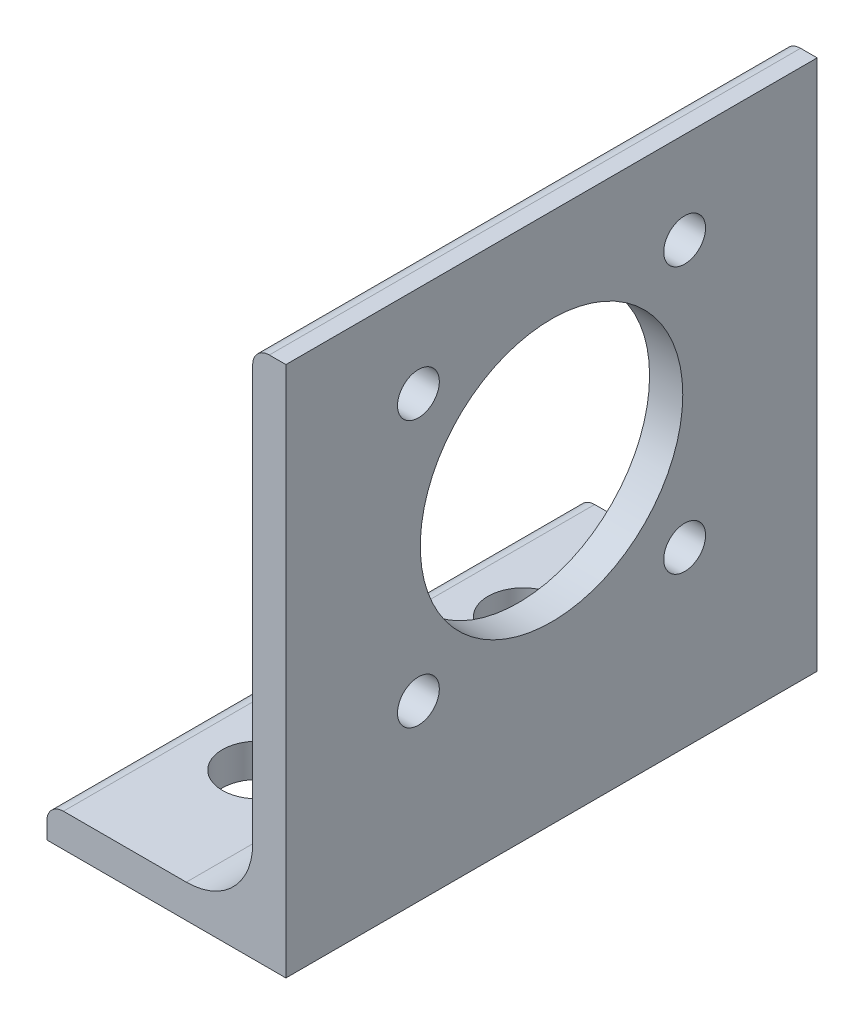
ISO-10303-21;
HEADER;
FILE_DESCRIPTION(('STEP AP214'),'2;1');
FILE_NAME('part.step','',(''),(''),'','','');
FILE_SCHEMA(('AUTOMOTIVE_DESIGN { 1 0 10303 214 1 1 1 1 }'));
ENDSEC;
DATA;
#1=APPLICATION_CONTEXT('core data for automotive mechanical design processes');
#2=APPLICATION_PROTOCOL_DEFINITION('international standard','automotive_design',2000,#1);
#3=PRODUCT_CONTEXT('',#1,'mechanical');
#4=PRODUCT('Part','Part','',(#3));
#5=PRODUCT_RELATED_PRODUCT_CATEGORY('part','',(#4));
#6=PRODUCT_DEFINITION_FORMATION('','',#4);
#7=PRODUCT_DEFINITION_CONTEXT('part definition',#1,'design');
#8=PRODUCT_DEFINITION('design','',#6,#7);
#9=PRODUCT_DEFINITION_SHAPE('','',#8);
#10=(LENGTH_UNIT() NAMED_UNIT(*) SI_UNIT(.MILLI.,.METRE.));
#11=(NAMED_UNIT(*) PLANE_ANGLE_UNIT() SI_UNIT($,.RADIAN.));
#12=(NAMED_UNIT(*) SI_UNIT($,.STERADIAN.) SOLID_ANGLE_UNIT());
#13=UNCERTAINTY_MEASURE_WITH_UNIT(LENGTH_MEASURE(1.E-05),#10,'distance_accuracy_value','');
#14=(GEOMETRIC_REPRESENTATION_CONTEXT(3) GLOBAL_UNCERTAINTY_ASSIGNED_CONTEXT((#13)) GLOBAL_UNIT_ASSIGNED_CONTEXT((#10,
#11,#12)) REPRESENTATION_CONTEXT('',''));
#15=CARTESIAN_POINT('',(0.,0.,0.));
#16=DIRECTION('',(0.,0.,1.));
#17=DIRECTION('',(1.,0.,0.));
#18=AXIS2_PLACEMENT_3D('',#15,#16,#17);
#19=CARTESIAN_POINT('',(-25.4,0.,25.4));
#20=DIRECTION('',(0.,1.,0.));
#21=DIRECTION('',(0.,0.,1.));
#22=AXIS2_PLACEMENT_3D('',#19,#20,#21);
#23=PLANE('',#22);
#24=CARTESIAN_POINT('',(10.00125,0.,-12.7));
#25=DIRECTION('',(0.,1.,0.));
#26=DIRECTION('',(-1.,0.,0.));
#27=AXIS2_PLACEMENT_3D('',#24,#25,#26);
#28=CIRCLE('',#27,3.3782);
#29=CARTESIAN_POINT('',(6.62305000000001,0.,-12.7));
#30=VERTEX_POINT('',#29);
#31=EDGE_CURVE('E220',#30,#30,#28,.T.);
#32=ORIENTED_EDGE('',*,*,#31,.T.);
#33=EDGE_LOOP('',(#32));
#34=FACE_BOUND('',#33,.T.);
#35=CARTESIAN_POINT('',(10.00125,0.,12.7));
#36=DIRECTION('',(0.,1.,0.));
#37=DIRECTION('',(-1.,0.,0.));
#38=AXIS2_PLACEMENT_3D('',#35,#36,#37);
#39=CIRCLE('',#38,3.3782);
#40=CARTESIAN_POINT('',(6.62305000000001,0.,12.7));
#41=VERTEX_POINT('',#40);
#42=EDGE_CURVE('E209',#41,#41,#39,.T.);
#43=ORIENTED_EDGE('',*,*,#42,.T.);
#44=EDGE_LOOP('',(#43));
#45=FACE_BOUND('',#44,.T.);
#46=DIRECTION('',(1.,0.,0.));
#47=VECTOR('',#46,1.);
#48=CARTESIAN_POINT('',(-25.4,0.,25.4));
#49=LINE('',#48,#47);
#50=CARTESIAN_POINT('',(2.54,0.,25.4));
#51=VERTEX_POINT('',#50);
#52=CARTESIAN_POINT('',(25.4,0.,25.4));
#53=VERTEX_POINT('',#52);
#54=EDGE_CURVE('E124',#51,#53,#49,.T.);
#55=ORIENTED_EDGE('',*,*,#54,.F.);
#56=DIRECTION('',(0.,0.,-1.));
#57=VECTOR('',#56,1.);
#58=CARTESIAN_POINT('',(2.54,0.,25.4));
#59=LINE('',#58,#57);
#60=CARTESIAN_POINT('',(2.54,0.,-25.4));
#61=VERTEX_POINT('',#60);
#62=EDGE_CURVE('E111',#51,#61,#59,.T.);
#63=ORIENTED_EDGE('',*,*,#62,.T.);
#64=DIRECTION('',(1.,0.,0.));
#65=VECTOR('',#64,1.);
#66=CARTESIAN_POINT('',(-25.4,0.,-25.4));
#67=LINE('',#66,#65);
#68=CARTESIAN_POINT('',(25.4,0.,-25.4));
#69=VERTEX_POINT('',#68);
#70=EDGE_CURVE('E122',#61,#69,#67,.T.);
#71=ORIENTED_EDGE('',*,*,#70,.T.);
#72=DIRECTION('',(0.,0.,-1.));
#73=VECTOR('',#72,1.);
#74=CARTESIAN_POINT('',(25.4,0.,25.4));
#75=LINE('',#74,#73);
#76=EDGE_CURVE('E118',#53,#69,#75,.T.);
#77=ORIENTED_EDGE('',*,*,#76,.F.);
#78=EDGE_LOOP('',(#55,#63,#71,#77));
#79=FACE_BOUND('',#78,.T.);
#80=ADVANCED_FACE('F38',(#34,#45,#79),#23,.F.);
#81=CARTESIAN_POINT('',(25.4,0.,25.4));
#82=DIRECTION('',(-1.,0.,0.));
#83=DIRECTION('',(0.,0.,1.));
#84=AXIS2_PLACEMENT_3D('',#81,#82,#83);
#85=PLANE('',#84);
#86=CARTESIAN_POINT('',(25.4,16.6,12.7279220196385));
#87=DIRECTION('',(1.,0.,0.));
#88=DIRECTION('',(0.,0.,-1.));
#89=AXIS2_PLACEMENT_3D('',#86,#87,#88);
#90=CIRCLE('',#89,2.000000064);
#91=CARTESIAN_POINT('',(25.4,16.6,10.7279219556385));
#92=VERTEX_POINT('',#91);
#93=EDGE_CURVE('E346',#92,#92,#90,.T.);
#94=ORIENTED_EDGE('',*,*,#93,.F.);
#95=EDGE_LOOP('',(#94));
#96=FACE_BOUND('',#95,.T.);
#97=CARTESIAN_POINT('',(25.4,42.0558440392772,12.7279220196385));
#98=DIRECTION('',(1.,0.,0.));
#99=DIRECTION('',(0.,0.,-1.));
#100=AXIS2_PLACEMENT_3D('',#97,#98,#99);
#101=CIRCLE('',#100,2.000000064);
#102=CARTESIAN_POINT('',(25.4,42.0558440392772,10.7279219556385));
#103=VERTEX_POINT('',#102);
#104=EDGE_CURVE('E343',#103,#103,#101,.T.);
#105=ORIENTED_EDGE('',*,*,#104,.F.);
#106=EDGE_LOOP('',(#105));
#107=FACE_BOUND('',#106,.T.);
#108=CARTESIAN_POINT('',(25.4,29.3279220196387,0.));
#109=DIRECTION('',(1.,0.,0.));
#110=DIRECTION('',(0.,0.,-1.));
#111=AXIS2_PLACEMENT_3D('',#108,#109,#110);
#112=CIRCLE('',#111,12.5499999999999);
#113=CARTESIAN_POINT('',(25.4,29.3279220196387,-12.55));
#114=VERTEX_POINT('',#113);
#115=EDGE_CURVE('E328',#114,#114,#112,.T.);
#116=ORIENTED_EDGE('',*,*,#115,.F.);
#117=EDGE_LOOP('',(#116));
#118=FACE_BOUND('',#117,.T.);
#119=CARTESIAN_POINT('',(25.4,42.0558440392772,-12.7279220196385));
#120=DIRECTION('',(1.,0.,0.));
#121=DIRECTION('',(0.,0.,-1.));
#122=AXIS2_PLACEMENT_3D('',#119,#120,#121);
#123=CIRCLE('',#122,2.000000064);
#124=CARTESIAN_POINT('',(25.4,42.0558440392772,-14.7279220836385));
#125=VERTEX_POINT('',#124);
#126=EDGE_CURVE('E339',#125,#125,#123,.T.);
#127=ORIENTED_EDGE('',*,*,#126,.F.);
#128=EDGE_LOOP('',(#127));
#129=FACE_BOUND('',#128,.T.);
#130=CARTESIAN_POINT('',(25.4,16.6,-12.7279220196385));
#131=DIRECTION('',(1.,0.,0.));
#132=DIRECTION('',(0.,0.,-1.));
#133=AXIS2_PLACEMENT_3D('',#130,#131,#132);
#134=CIRCLE('',#133,2.000000064);
#135=CARTESIAN_POINT('',(25.4,16.6,-14.7279220836385));
#136=VERTEX_POINT('',#135);
#137=EDGE_CURVE('E190',#136,#136,#134,.T.);
#138=ORIENTED_EDGE('',*,*,#137,.F.);
#139=EDGE_LOOP('',(#138));
#140=FACE_BOUND('',#139,.T.);
#141=DIRECTION('',(0.,1.,0.));
#142=VECTOR('',#141,1.);
#143=CARTESIAN_POINT('',(25.4,0.,-25.4));
#144=LINE('',#143,#142);
#145=CARTESIAN_POINT('',(25.4,50.8,-25.4));
#146=VERTEX_POINT('',#145);
#147=EDGE_CURVE('E131',#69,#146,#144,.T.);
#148=ORIENTED_EDGE('',*,*,#147,.T.);
#149=DIRECTION('',(0.,0.,-1.));
#150=VECTOR('',#149,1.);
#151=CARTESIAN_POINT('',(25.4,50.8,25.4));
#152=LINE('',#151,#150);
#153=CARTESIAN_POINT('',(25.4,50.8,25.4));
#154=VERTEX_POINT('',#153);
#155=EDGE_CURVE('E172',#154,#146,#152,.T.);
#156=ORIENTED_EDGE('',*,*,#155,.F.);
#157=DIRECTION('',(0.,1.,0.));
#158=VECTOR('',#157,1.);
#159=CARTESIAN_POINT('',(25.4,0.,25.4));
#160=LINE('',#159,#158);
#161=EDGE_CURVE('E224',#53,#154,#160,.T.);
#162=ORIENTED_EDGE('',*,*,#161,.F.);
#163=ORIENTED_EDGE('',*,*,#76,.T.);
#164=EDGE_LOOP('',(#148,#156,#162,#163));
#165=FACE_BOUND('',#164,.T.);
#166=ADVANCED_FACE('F267',(#96,#107,#118,#129,#140,#165),#85,.F.);
#167=CARTESIAN_POINT('',(23.8125,50.8,25.4));
#168=DIRECTION('',(0.,-1.,0.));
#169=DIRECTION('',(0.,0.,-1.));
#170=AXIS2_PLACEMENT_3D('',#167,#168,#169);
#171=PLANE('',#170);
#172=DIRECTION('',(-1.,0.,0.));
#173=VECTOR('',#172,1.);
#174=CARTESIAN_POINT('',(23.8125,50.8,-25.4));
#175=LINE('',#174,#173);
#176=CARTESIAN_POINT('',(23.8125,50.8,-25.4));
#177=VERTEX_POINT('',#176);
#178=EDGE_CURVE('E135',#146,#177,#175,.T.);
#179=ORIENTED_EDGE('',*,*,#178,.T.);
#180=DIRECTION('',(0.,0.,-1.));
#181=VECTOR('',#180,1.);
#182=CARTESIAN_POINT('',(23.8125,50.8,25.4));
#183=LINE('',#182,#181);
#184=CARTESIAN_POINT('',(23.8125,50.8,25.4));
#185=VERTEX_POINT('',#184);
#186=EDGE_CURVE('E168',#185,#177,#183,.T.);
#187=ORIENTED_EDGE('',*,*,#186,.F.);
#188=DIRECTION('',(-1.,0.,0.));
#189=VECTOR('',#188,1.);
#190=CARTESIAN_POINT('',(23.8125,50.8,25.4));
#191=LINE('',#190,#189);
#192=EDGE_CURVE('E227',#154,#185,#191,.T.);
#193=ORIENTED_EDGE('',*,*,#192,.F.);
#194=ORIENTED_EDGE('',*,*,#155,.T.);
#195=EDGE_LOOP('',(#179,#187,#193,#194));
#196=FACE_BOUND('',#195,.T.);
#197=ADVANCED_FACE('F262',(#196),#171,.F.);
#198=CARTESIAN_POINT('',(23.8125,49.2125,25.4));
#199=DIRECTION('',(0.,0.,-1.));
#200=DIRECTION('',(-1.,0.,0.));
#201=AXIS2_PLACEMENT_3D('',#198,#199,#200);
#202=CYLINDRICAL_SURFACE('',#201,1.5875);
#203=CARTESIAN_POINT('',(23.8125,49.2125,-25.4));
#204=DIRECTION('',(0.,0.,1.));
#205=DIRECTION('',(-1.,0.,0.));
#206=AXIS2_PLACEMENT_3D('',#203,#204,#205);
#207=CIRCLE('',#206,1.5875);
#208=CARTESIAN_POINT('',(22.225,49.2125,-25.4));
#209=VERTEX_POINT('',#208);
#210=EDGE_CURVE('E143',#177,#209,#207,.T.);
#211=ORIENTED_EDGE('',*,*,#210,.T.);
#212=DIRECTION('',(0.,0.,-1.));
#213=VECTOR('',#212,1.);
#214=CARTESIAN_POINT('',(22.225,49.2125,25.4));
#215=LINE('',#214,#213);
#216=CARTESIAN_POINT('',(22.225,49.2125,25.4));
#217=VERTEX_POINT('',#216);
#218=EDGE_CURVE('E164',#217,#209,#215,.T.);
#219=ORIENTED_EDGE('',*,*,#218,.F.);
#220=CARTESIAN_POINT('',(23.8125,49.2125,25.4));
#221=DIRECTION('',(0.,0.,1.));
#222=DIRECTION('',(-1.,0.,0.));
#223=AXIS2_PLACEMENT_3D('',#220,#221,#222);
#224=CIRCLE('',#223,1.5875);
#225=EDGE_CURVE('E230',#185,#217,#224,.T.);
#226=ORIENTED_EDGE('',*,*,#225,.F.);
#227=ORIENTED_EDGE('',*,*,#186,.T.);
#228=EDGE_LOOP('',(#211,#219,#226,#227));
#229=FACE_BOUND('',#228,.T.);
#230=ADVANCED_FACE('F259',(#229),#202,.T.);
#231=CARTESIAN_POINT('',(22.225,49.2125,25.4));
#232=DIRECTION('',(1.,0.,0.));
#233=DIRECTION('',(0.,0.,-1.));
#234=AXIS2_PLACEMENT_3D('',#231,#232,#233);
#235=PLANE('',#234);
#236=CARTESIAN_POINT('',(22.225,16.6,12.7279220196385));
#237=DIRECTION('',(1.,0.,0.));
#238=DIRECTION('',(0.,0.,-1.));
#239=AXIS2_PLACEMENT_3D('',#236,#237,#238);
#240=CIRCLE('',#239,2.000000064);
#241=CARTESIAN_POINT('',(22.225,16.6,10.7279219556385));
#242=VERTEX_POINT('',#241);
#243=EDGE_CURVE('E42',#242,#242,#240,.T.);
#244=ORIENTED_EDGE('',*,*,#243,.T.);
#245=EDGE_LOOP('',(#244));
#246=FACE_BOUND('',#245,.T.);
#247=CARTESIAN_POINT('',(22.225,42.0558440392772,12.7279220196385));
#248=DIRECTION('',(1.,0.,0.));
#249=DIRECTION('',(0.,0.,-1.));
#250=AXIS2_PLACEMENT_3D('',#247,#248,#249);
#251=CIRCLE('',#250,2.000000064);
#252=CARTESIAN_POINT('',(22.225,42.0558440392772,10.7279219556385));
#253=VERTEX_POINT('',#252);
#254=EDGE_CURVE('E197',#253,#253,#251,.T.);
#255=ORIENTED_EDGE('',*,*,#254,.T.);
#256=EDGE_LOOP('',(#255));
#257=FACE_BOUND('',#256,.T.);
#258=CARTESIAN_POINT('',(22.225,29.3279220196387,0.));
#259=DIRECTION('',(1.,0.,0.));
#260=DIRECTION('',(0.,0.,-1.));
#261=AXIS2_PLACEMENT_3D('',#258,#259,#260);
#262=CIRCLE('',#261,12.5499999999999);
#263=CARTESIAN_POINT('',(22.225,29.3279220196387,-12.55));
#264=VERTEX_POINT('',#263);
#265=EDGE_CURVE('E194',#264,#264,#262,.T.);
#266=ORIENTED_EDGE('',*,*,#265,.T.);
#267=EDGE_LOOP('',(#266));
#268=FACE_BOUND('',#267,.T.);
#269=CARTESIAN_POINT('',(22.225,42.0558440392772,-12.7279220196385));
#270=DIRECTION('',(1.,0.,0.));
#271=DIRECTION('',(0.,0.,-1.));
#272=AXIS2_PLACEMENT_3D('',#269,#270,#271);
#273=CIRCLE('',#272,2.000000064);
#274=CARTESIAN_POINT('',(22.225,42.0558440392772,-14.7279220836385));
#275=VERTEX_POINT('',#274);
#276=EDGE_CURVE('E189',#275,#275,#273,.T.);
#277=ORIENTED_EDGE('',*,*,#276,.T.);
#278=EDGE_LOOP('',(#277));
#279=FACE_BOUND('',#278,.T.);
#280=CARTESIAN_POINT('',(22.225,16.6,-12.7279220196385));
#281=DIRECTION('',(1.,0.,0.));
#282=DIRECTION('',(0.,0.,-1.));
#283=AXIS2_PLACEMENT_3D('',#280,#281,#282);
#284=CIRCLE('',#283,2.000000064);
#285=CARTESIAN_POINT('',(22.225,16.6,-14.7279220836385));
#286=VERTEX_POINT('',#285);
#287=EDGE_CURVE('E185',#286,#286,#284,.T.);
#288=ORIENTED_EDGE('',*,*,#287,.T.);
#289=EDGE_LOOP('',(#288));
#290=FACE_BOUND('',#289,.T.);
#291=DIRECTION('',(0.,-1.,0.));
#292=VECTOR('',#291,1.);
#293=CARTESIAN_POINT('',(22.225,49.2125,-25.4));
#294=LINE('',#293,#292);
#295=CARTESIAN_POINT('',(22.225,9.525,-25.4));
#296=VERTEX_POINT('',#295);
#297=EDGE_CURVE('E146',#209,#296,#294,.T.);
#298=ORIENTED_EDGE('',*,*,#297,.T.);
#299=DIRECTION('',(0.,0.,-1.));
#300=VECTOR('',#299,1.);
#301=CARTESIAN_POINT('',(22.225,9.525,25.4));
#302=LINE('',#301,#300);
#303=CARTESIAN_POINT('',(22.225,9.525,25.4));
#304=VERTEX_POINT('',#303);
#305=EDGE_CURVE('E160',#304,#296,#302,.T.);
#306=ORIENTED_EDGE('',*,*,#305,.F.);
#307=DIRECTION('',(0.,-1.,0.));
#308=VECTOR('',#307,1.);
#309=CARTESIAN_POINT('',(22.225,49.2125,25.4));
#310=LINE('',#309,#308);
#311=EDGE_CURVE('E233',#217,#304,#310,.T.);
#312=ORIENTED_EDGE('',*,*,#311,.F.);
#313=ORIENTED_EDGE('',*,*,#218,.T.);
#314=EDGE_LOOP('',(#298,#306,#312,#313));
#315=FACE_BOUND('',#314,.T.);
#316=ADVANCED_FACE('F255',(#246,#257,#268,#279,#290,#315),#235,.F.);
#317=CARTESIAN_POINT('',(15.875,9.525,25.4));
#318=DIRECTION('',(0.,0.,-1.));
#319=DIRECTION('',(-1.,0.,0.));
#320=AXIS2_PLACEMENT_3D('',#317,#318,#319);
#321=CYLINDRICAL_SURFACE('',#320,6.35);
#322=CARTESIAN_POINT('',(15.875,9.525,-25.4));
#323=DIRECTION('',(0.,0.,-1.));
#324=DIRECTION('',(-1.,0.,0.));
#325=AXIS2_PLACEMENT_3D('',#322,#323,#324);
#326=CIRCLE('',#325,6.35);
#327=CARTESIAN_POINT('',(15.875,3.175,-25.4));
#328=VERTEX_POINT('',#327);
#329=EDGE_CURVE('E149',#296,#328,#326,.T.);
#330=ORIENTED_EDGE('',*,*,#329,.T.);
#331=DIRECTION('',(0.,0.,-1.));
#332=VECTOR('',#331,1.);
#333=CARTESIAN_POINT('',(15.875,3.175,25.4));
#334=LINE('',#333,#332);
#335=CARTESIAN_POINT('',(15.875,3.175,25.4));
#336=VERTEX_POINT('',#335);
#337=EDGE_CURVE('E156',#336,#328,#334,.T.);
#338=ORIENTED_EDGE('',*,*,#337,.F.);
#339=CARTESIAN_POINT('',(15.875,9.525,25.4));
#340=DIRECTION('',(0.,0.,-1.));
#341=DIRECTION('',(-1.,0.,0.));
#342=AXIS2_PLACEMENT_3D('',#339,#340,#341);
#343=CIRCLE('',#342,6.35);
#344=EDGE_CURVE('E235',#304,#336,#343,.T.);
#345=ORIENTED_EDGE('',*,*,#344,.F.);
#346=ORIENTED_EDGE('',*,*,#305,.T.);
#347=EDGE_LOOP('',(#330,#338,#345,#346));
#348=FACE_BOUND('',#347,.T.);
#349=ADVANCED_FACE('F251',(#348),#321,.F.);
#350=CARTESIAN_POINT('',(15.875,3.175,25.4));
#351=DIRECTION('',(0.,-1.,0.));
#352=DIRECTION('',(1.,0.,0.));
#353=AXIS2_PLACEMENT_3D('',#350,#351,#352);
#354=PLANE('',#353);
#355=CARTESIAN_POINT('',(10.00125,3.175,-12.7));
#356=DIRECTION('',(0.,1.,0.));
#357=DIRECTION('',(-1.,0.,0.));
#358=AXIS2_PLACEMENT_3D('',#355,#356,#357);
#359=CIRCLE('',#358,3.3782);
#360=CARTESIAN_POINT('',(6.62305000000001,3.175,-12.7));
#361=VERTEX_POINT('',#360);
#362=EDGE_CURVE('E215',#361,#361,#359,.T.);
#363=ORIENTED_EDGE('',*,*,#362,.F.);
#364=EDGE_LOOP('',(#363));
#365=FACE_BOUND('',#364,.T.);
#366=CARTESIAN_POINT('',(10.00125,3.175,12.7));
#367=DIRECTION('',(0.,1.,0.));
#368=DIRECTION('',(-1.,0.,0.));
#369=AXIS2_PLACEMENT_3D('',#366,#367,#368);
#370=CIRCLE('',#369,3.3782);
#371=CARTESIAN_POINT('',(6.62305000000001,3.175,12.7));
#372=VERTEX_POINT('',#371);
#373=EDGE_CURVE('E204',#372,#372,#370,.T.);
#374=ORIENTED_EDGE('',*,*,#373,.F.);
#375=EDGE_LOOP('',(#374));
#376=FACE_BOUND('',#375,.T.);
#377=DIRECTION('',(-1.,0.,0.));
#378=VECTOR('',#377,1.);
#379=CARTESIAN_POINT('',(15.875,3.175,-25.4));
#380=LINE('',#379,#378);
#381=CARTESIAN_POINT('',(4.1275,3.175,-25.4));
#382=VERTEX_POINT('',#381);
#383=EDGE_CURVE('E152',#328,#382,#380,.T.);
#384=ORIENTED_EDGE('',*,*,#383,.T.);
#385=DIRECTION('',(0.,0.,1.));
#386=VECTOR('',#385,1.);
#387=CARTESIAN_POINT('',(4.1275,3.175,25.4));
#388=LINE('',#387,#386);
#389=CARTESIAN_POINT('',(4.1275,3.175,25.4));
#390=VERTEX_POINT('',#389);
#391=EDGE_CURVE('E117',#382,#390,#388,.T.);
#392=ORIENTED_EDGE('',*,*,#391,.T.);
#393=DIRECTION('',(-1.,0.,0.));
#394=VECTOR('',#393,1.);
#395=CARTESIAN_POINT('',(15.875,3.175,25.4));
#396=LINE('',#395,#394);
#397=EDGE_CURVE('E138',#336,#390,#396,.T.);
#398=ORIENTED_EDGE('',*,*,#397,.F.);
#399=ORIENTED_EDGE('',*,*,#337,.T.);
#400=EDGE_LOOP('',(#384,#392,#398,#399));
#401=FACE_BOUND('',#400,.T.);
#402=ADVANCED_FACE('F243',(#365,#376,#401),#354,.F.);
#403=CARTESIAN_POINT('',(23.8125,49.2125,25.4));
#404=DIRECTION('',(0.,0.,-1.));
#405=DIRECTION('',(-1.,0.,0.));
#406=AXIS2_PLACEMENT_3D('',#403,#404,#405);
#407=PLANE('',#406);
#408=ORIENTED_EDGE('',*,*,#397,.T.);
#409=CARTESIAN_POINT('',(4.1275,1.5875,25.4));
#410=DIRECTION('',(0.,0.,-1.));
#411=DIRECTION('',(-1.,0.,0.));
#412=AXIS2_PLACEMENT_3D('',#409,#410,#411);
#413=CIRCLE('',#412,1.5875);
#414=CARTESIAN_POINT('',(2.54,1.5875,25.4));
#415=VERTEX_POINT('',#414);
#416=EDGE_CURVE('E63',#390,#415,#413,.F.);
#417=ORIENTED_EDGE('',*,*,#416,.T.);
#418=DIRECTION('',(0.,-1.,0.));
#419=VECTOR('',#418,1.);
#420=CARTESIAN_POINT('',(2.54,8.39955257270711,25.4));
#421=LINE('',#420,#419);
#422=EDGE_CURVE('E126',#415,#51,#421,.T.);
#423=ORIENTED_EDGE('',*,*,#422,.T.);
#424=ORIENTED_EDGE('',*,*,#54,.T.);
#425=ORIENTED_EDGE('',*,*,#161,.T.);
#426=ORIENTED_EDGE('',*,*,#192,.T.);
#427=ORIENTED_EDGE('',*,*,#225,.T.);
#428=ORIENTED_EDGE('',*,*,#311,.T.);
#429=ORIENTED_EDGE('',*,*,#344,.T.);
#430=EDGE_LOOP('',(#408,#417,#423,#424,#425,#426,#427,#428,#429));
#431=FACE_BOUND('',#430,.T.);
#432=ADVANCED_FACE('F241',(#431),#407,.F.);
#433=CARTESIAN_POINT('',(23.8125,49.2125,-25.4));
#434=DIRECTION('',(0.,0.,-1.));
#435=DIRECTION('',(-1.,0.,0.));
#436=AXIS2_PLACEMENT_3D('',#433,#434,#435);
#437=PLANE('',#436);
#438=DIRECTION('',(0.,-1.,0.));
#439=VECTOR('',#438,1.);
#440=CARTESIAN_POINT('',(2.54,49.2125,-25.4));
#441=LINE('',#440,#439);
#442=CARTESIAN_POINT('',(2.54,1.5875,-25.4));
#443=VERTEX_POINT('',#442);
#444=EDGE_CURVE('E108',#443,#61,#441,.T.);
#445=ORIENTED_EDGE('',*,*,#444,.F.);
#446=CARTESIAN_POINT('',(4.1275,1.5875,-25.4));
#447=DIRECTION('',(0.,0.,-1.));
#448=DIRECTION('',(-1.,0.,0.));
#449=AXIS2_PLACEMENT_3D('',#446,#447,#448);
#450=CIRCLE('',#449,1.5875);
#451=EDGE_CURVE('E11',#443,#382,#450,.T.);
#452=ORIENTED_EDGE('',*,*,#451,.T.);
#453=ORIENTED_EDGE('',*,*,#383,.F.);
#454=ORIENTED_EDGE('',*,*,#329,.F.);
#455=ORIENTED_EDGE('',*,*,#297,.F.);
#456=ORIENTED_EDGE('',*,*,#210,.F.);
#457=ORIENTED_EDGE('',*,*,#178,.F.);
#458=ORIENTED_EDGE('',*,*,#147,.F.);
#459=ORIENTED_EDGE('',*,*,#70,.F.);
#460=EDGE_LOOP('',(#445,#452,#453,#454,#455,#456,#457,#458,#459));
#461=FACE_BOUND('',#460,.T.);
#462=ADVANCED_FACE('F129',(#461),#437,.T.);
#463=CARTESIAN_POINT('',(2.54,8.39955257270711,25.4));
#464=DIRECTION('',(1.,0.,0.));
#465=DIRECTION('',(0.,1.,0.));
#466=AXIS2_PLACEMENT_3D('',#463,#464,#465);
#467=PLANE('',#466);
#468=ORIENTED_EDGE('',*,*,#422,.F.);
#469=DIRECTION('',(0.,0.,1.));
#470=VECTOR('',#469,1.);
#471=CARTESIAN_POINT('',(2.54,1.5875,25.4));
#472=LINE('',#471,#470);
#473=EDGE_CURVE('E48',#415,#443,#472,.F.);
#474=ORIENTED_EDGE('',*,*,#473,.T.);
#475=ORIENTED_EDGE('',*,*,#444,.T.);
#476=ORIENTED_EDGE('',*,*,#62,.F.);
#477=EDGE_LOOP('',(#468,#474,#475,#476));
#478=FACE_BOUND('',#477,.T.);
#479=ADVANCED_FACE('F110',(#478),#467,.F.);
#480=CARTESIAN_POINT('',(4.1275,1.5875,25.4));
#481=DIRECTION('',(0.,0.,1.));
#482=DIRECTION('',(1.,0.,0.));
#483=AXIS2_PLACEMENT_3D('',#480,#481,#482);
#484=CYLINDRICAL_SURFACE('',#483,1.5875);
#485=ORIENTED_EDGE('',*,*,#451,.F.);
#486=ORIENTED_EDGE('',*,*,#473,.F.);
#487=ORIENTED_EDGE('',*,*,#416,.F.);
#488=ORIENTED_EDGE('',*,*,#391,.F.);
#489=EDGE_LOOP('',(#485,#486,#487,#488));
#490=FACE_BOUND('',#489,.T.);
#491=ADVANCED_FACE('F40',(#490),#484,.T.);
#492=CARTESIAN_POINT('',(10.00125,0.,12.7));
#493=DIRECTION('',(0.,1.,0.));
#494=DIRECTION('',(-1.,0.,0.));
#495=AXIS2_PLACEMENT_3D('',#492,#493,#494);
#496=CYLINDRICAL_SURFACE('',#495,3.3782);
#497=ORIENTED_EDGE('',*,*,#42,.F.);
#498=EDGE_LOOP('',(#497));
#499=FACE_BOUND('',#498,.T.);
#500=ORIENTED_EDGE('',*,*,#373,.T.);
#501=EDGE_LOOP('',(#500));
#502=FACE_BOUND('',#501,.T.);
#503=ADVANCED_FACE('F296',(#499,#502),#496,.F.);
#504=CARTESIAN_POINT('',(10.00125,0.,-12.7));
#505=DIRECTION('',(0.,1.,0.));
#506=DIRECTION('',(-1.,0.,0.));
#507=AXIS2_PLACEMENT_3D('',#504,#505,#506);
#508=CYLINDRICAL_SURFACE('',#507,3.3782);
#509=ORIENTED_EDGE('',*,*,#31,.F.);
#510=EDGE_LOOP('',(#509));
#511=FACE_BOUND('',#510,.T.);
#512=ORIENTED_EDGE('',*,*,#362,.T.);
#513=EDGE_LOOP('',(#512));
#514=FACE_BOUND('',#513,.T.);
#515=ADVANCED_FACE('F299',(#511,#514),#508,.F.);
#516=CARTESIAN_POINT('',(2.54,16.6,-12.7279220196385));
#517=DIRECTION('',(1.,0.,0.));
#518=DIRECTION('',(0.,0.,-1.));
#519=AXIS2_PLACEMENT_3D('',#516,#517,#518);
#520=CYLINDRICAL_SURFACE('',#519,2.000000064);
#521=ORIENTED_EDGE('',*,*,#137,.T.);
#522=EDGE_LOOP('',(#521));
#523=FACE_BOUND('',#522,.T.);
#524=ORIENTED_EDGE('',*,*,#287,.F.);
#525=EDGE_LOOP('',(#524));
#526=FACE_BOUND('',#525,.T.);
#527=ADVANCED_FACE('F303',(#523,#526),#520,.F.);
#528=CARTESIAN_POINT('',(2.54,42.0558440392772,-12.7279220196385));
#529=DIRECTION('',(1.,0.,0.));
#530=DIRECTION('',(0.,0.,-1.));
#531=AXIS2_PLACEMENT_3D('',#528,#529,#530);
#532=CYLINDRICAL_SURFACE('',#531,2.000000064);
#533=ORIENTED_EDGE('',*,*,#126,.T.);
#534=EDGE_LOOP('',(#533));
#535=FACE_BOUND('',#534,.T.);
#536=ORIENTED_EDGE('',*,*,#276,.F.);
#537=EDGE_LOOP('',(#536));
#538=FACE_BOUND('',#537,.T.);
#539=ADVANCED_FACE('F307',(#535,#538),#532,.F.);
#540=CARTESIAN_POINT('',(2.54,29.3279220196387,0.));
#541=DIRECTION('',(1.,0.,0.));
#542=DIRECTION('',(0.,0.,-1.));
#543=AXIS2_PLACEMENT_3D('',#540,#541,#542);
#544=CYLINDRICAL_SURFACE('',#543,12.5499999999999);
#545=ORIENTED_EDGE('',*,*,#115,.T.);
#546=EDGE_LOOP('',(#545));
#547=FACE_BOUND('',#546,.T.);
#548=ORIENTED_EDGE('',*,*,#265,.F.);
#549=EDGE_LOOP('',(#548));
#550=FACE_BOUND('',#549,.T.);
#551=ADVANCED_FACE('F313',(#547,#550),#544,.F.);
#552=CARTESIAN_POINT('',(2.54,42.0558440392772,12.7279220196385));
#553=DIRECTION('',(1.,0.,0.));
#554=DIRECTION('',(0.,0.,-1.));
#555=AXIS2_PLACEMENT_3D('',#552,#553,#554);
#556=CYLINDRICAL_SURFACE('',#555,2.000000064);
#557=ORIENTED_EDGE('',*,*,#104,.T.);
#558=EDGE_LOOP('',(#557));
#559=FACE_BOUND('',#558,.T.);
#560=ORIENTED_EDGE('',*,*,#254,.F.);
#561=EDGE_LOOP('',(#560));
#562=FACE_BOUND('',#561,.T.);
#563=ADVANCED_FACE('F309',(#559,#562),#556,.F.);
#564=CARTESIAN_POINT('',(2.54,16.6,12.7279220196385));
#565=DIRECTION('',(1.,0.,0.));
#566=DIRECTION('',(0.,0.,-1.));
#567=AXIS2_PLACEMENT_3D('',#564,#565,#566);
#568=CYLINDRICAL_SURFACE('',#567,2.000000064);
#569=ORIENTED_EDGE('',*,*,#93,.T.);
#570=EDGE_LOOP('',(#569));
#571=FACE_BOUND('',#570,.T.);
#572=ORIENTED_EDGE('',*,*,#243,.F.);
#573=EDGE_LOOP('',(#572));
#574=FACE_BOUND('',#573,.T.);
#575=ADVANCED_FACE('F312',(#571,#574),#568,.F.);
#576=CLOSED_SHELL('',(#80,#166,#197,#230,#316,#349,#402,#432,#462,#479,#491,#503,#515,#527,#539,
#551,#563,#575));
#577=MANIFOLD_SOLID_BREP('B2',#576);
#578=ADVANCED_BREP_SHAPE_REPRESENTATION('',(#18,#577),#14);
#579=SHAPE_DEFINITION_REPRESENTATION(#9,#578);
ENDSEC;
END-ISO-10303-21;
